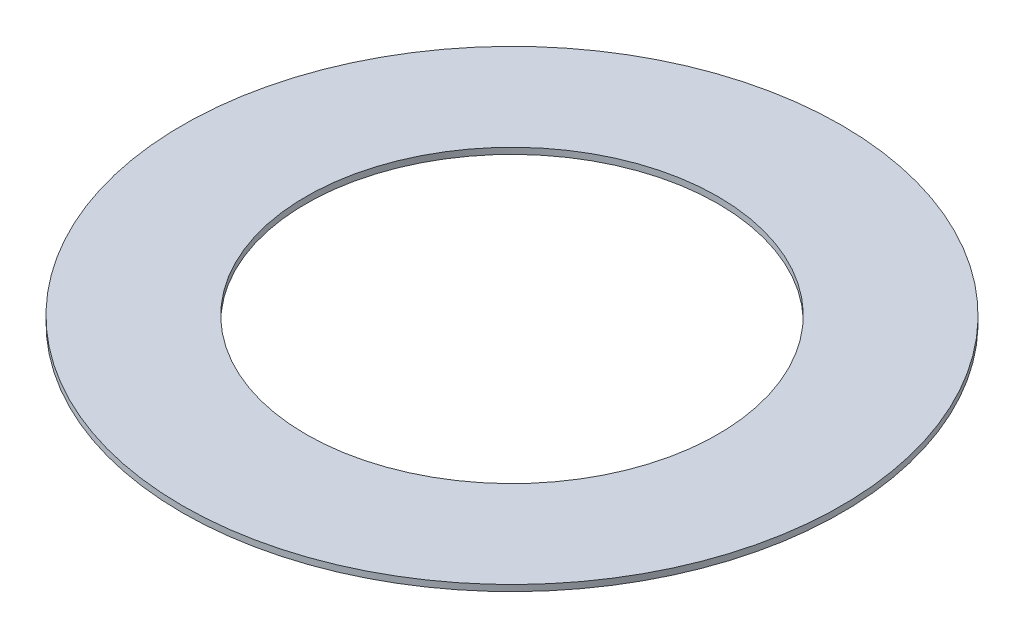
ISO-10303-21;
HEADER;
FILE_DESCRIPTION(('STEP AP214'),'2;1');
FILE_NAME('part.step','',(''),(''),'','','');
FILE_SCHEMA(('AUTOMOTIVE_DESIGN { 1 0 10303 214 1 1 1 1 }'));
ENDSEC;
DATA;
#1=APPLICATION_CONTEXT('core data for automotive mechanical design processes');
#2=APPLICATION_PROTOCOL_DEFINITION('international standard','automotive_design',2000,#1);
#3=PRODUCT_CONTEXT('',#1,'mechanical');
#4=PRODUCT('Part','Part','',(#3));
#5=PRODUCT_RELATED_PRODUCT_CATEGORY('part','',(#4));
#6=PRODUCT_DEFINITION_FORMATION('','',#4);
#7=PRODUCT_DEFINITION_CONTEXT('part definition',#1,'design');
#8=PRODUCT_DEFINITION('design','',#6,#7);
#9=PRODUCT_DEFINITION_SHAPE('','',#8);
#10=(LENGTH_UNIT() NAMED_UNIT(*) SI_UNIT(.MILLI.,.METRE.));
#11=(NAMED_UNIT(*) PLANE_ANGLE_UNIT() SI_UNIT($,.RADIAN.));
#12=(NAMED_UNIT(*) SI_UNIT($,.STERADIAN.) SOLID_ANGLE_UNIT());
#13=UNCERTAINTY_MEASURE_WITH_UNIT(LENGTH_MEASURE(1.E-05),#10,'distance_accuracy_value','');
#14=(GEOMETRIC_REPRESENTATION_CONTEXT(3) GLOBAL_UNCERTAINTY_ASSIGNED_CONTEXT((#13)) GLOBAL_UNIT_ASSIGNED_CONTEXT((#10,
#11,#12)) REPRESENTATION_CONTEXT('',''));
#15=CARTESIAN_POINT('',(0.,0.,0.));
#16=DIRECTION('',(0.,0.,1.));
#17=DIRECTION('',(1.,0.,0.));
#18=AXIS2_PLACEMENT_3D('',#15,#16,#17);
#19=CARTESIAN_POINT('',(0.,1.5,0.));
#20=DIRECTION('',(0.,1.,0.));
#21=DIRECTION('',(0.,0.,1.));
#22=AXIS2_PLACEMENT_3D('',#19,#20,#21);
#23=PLANE('',#22);
#24=CARTESIAN_POINT('',(0.,1.5,0.));
#25=DIRECTION('',(0.,1.,0.));
#26=DIRECTION('',(0.,0.,1.));
#27=AXIS2_PLACEMENT_3D('',#24,#25,#26);
#28=CIRCLE('',#27,80.);
#29=CARTESIAN_POINT('',(0.,1.5,80.));
#30=VERTEX_POINT('',#29);
#31=EDGE_CURVE('E10',#30,#30,#28,.T.);
#32=ORIENTED_EDGE('',*,*,#31,.T.);
#33=EDGE_LOOP('',(#32));
#34=FACE_BOUND('',#33,.T.);
#35=CARTESIAN_POINT('',(0.,1.5,0.));
#36=DIRECTION('',(0.,1.,0.));
#37=DIRECTION('',(0.,0.,1.));
#38=AXIS2_PLACEMENT_3D('',#35,#36,#37);
#39=CIRCLE('',#38,50.);
#40=CARTESIAN_POINT('',(0.,1.5,50.));
#41=VERTEX_POINT('',#40);
#42=EDGE_CURVE('E54',#41,#41,#39,.T.);
#43=ORIENTED_EDGE('',*,*,#42,.F.);
#44=EDGE_LOOP('',(#43));
#45=FACE_BOUND('',#44,.T.);
#46=ADVANCED_FACE('F43',(#34,#45),#23,.T.);
#47=CARTESIAN_POINT('',(0.,0.,0.));
#48=DIRECTION('',(0.,1.,0.));
#49=DIRECTION('',(0.,0.,1.));
#50=AXIS2_PLACEMENT_3D('',#47,#48,#49);
#51=PLANE('',#50);
#52=CARTESIAN_POINT('',(0.,0.,0.));
#53=DIRECTION('',(0.,1.,0.));
#54=DIRECTION('',(0.,0.,1.));
#55=AXIS2_PLACEMENT_3D('',#52,#53,#54);
#56=CIRCLE('',#55,80.);
#57=CARTESIAN_POINT('',(0.,0.,80.));
#58=VERTEX_POINT('',#57);
#59=EDGE_CURVE('E47',#58,#58,#56,.T.);
#60=ORIENTED_EDGE('',*,*,#59,.F.);
#61=EDGE_LOOP('',(#60));
#62=FACE_BOUND('',#61,.T.);
#63=CARTESIAN_POINT('',(0.,0.,0.));
#64=DIRECTION('',(0.,1.,0.));
#65=DIRECTION('',(0.,0.,1.));
#66=AXIS2_PLACEMENT_3D('',#63,#64,#65);
#67=CIRCLE('',#66,50.);
#68=CARTESIAN_POINT('',(0.,0.,50.));
#69=VERTEX_POINT('',#68);
#70=EDGE_CURVE('E56',#69,#69,#67,.T.);
#71=ORIENTED_EDGE('',*,*,#70,.T.);
#72=EDGE_LOOP('',(#71));
#73=FACE_BOUND('',#72,.T.);
#74=ADVANCED_FACE('F66',(#62,#73),#51,.F.);
#75=CARTESIAN_POINT('',(0.,1.5,0.));
#76=DIRECTION('',(0.,-1.,0.));
#77=DIRECTION('',(0.,0.,-1.));
#78=AXIS2_PLACEMENT_3D('',#75,#76,#77);
#79=CYLINDRICAL_SURFACE('',#78,80.);
#80=ORIENTED_EDGE('',*,*,#31,.F.);
#81=EDGE_LOOP('',(#80));
#82=FACE_BOUND('',#81,.T.);
#83=ORIENTED_EDGE('',*,*,#59,.T.);
#84=EDGE_LOOP('',(#83));
#85=FACE_BOUND('',#84,.T.);
#86=ADVANCED_FACE('F45',(#82,#85),#79,.T.);
#87=CARTESIAN_POINT('',(0.,1.5,0.));
#88=DIRECTION('',(0.,-1.,0.));
#89=DIRECTION('',(0.,0.,-1.));
#90=AXIS2_PLACEMENT_3D('',#87,#88,#89);
#91=CYLINDRICAL_SURFACE('',#90,50.);
#92=ORIENTED_EDGE('',*,*,#42,.T.);
#93=EDGE_LOOP('',(#92));
#94=FACE_BOUND('',#93,.T.);
#95=ORIENTED_EDGE('',*,*,#70,.F.);
#96=EDGE_LOOP('',(#95));
#97=FACE_BOUND('',#96,.T.);
#98=ADVANCED_FACE('F62',(#94,#97),#91,.F.);
#99=CLOSED_SHELL('',(#46,#74,#86,#98));
#100=MANIFOLD_SOLID_BREP('B2',#99);
#101=ADVANCED_BREP_SHAPE_REPRESENTATION('',(#18,#100),#14);
#102=SHAPE_DEFINITION_REPRESENTATION(#9,#101);
ENDSEC;
END-ISO-10303-21;
